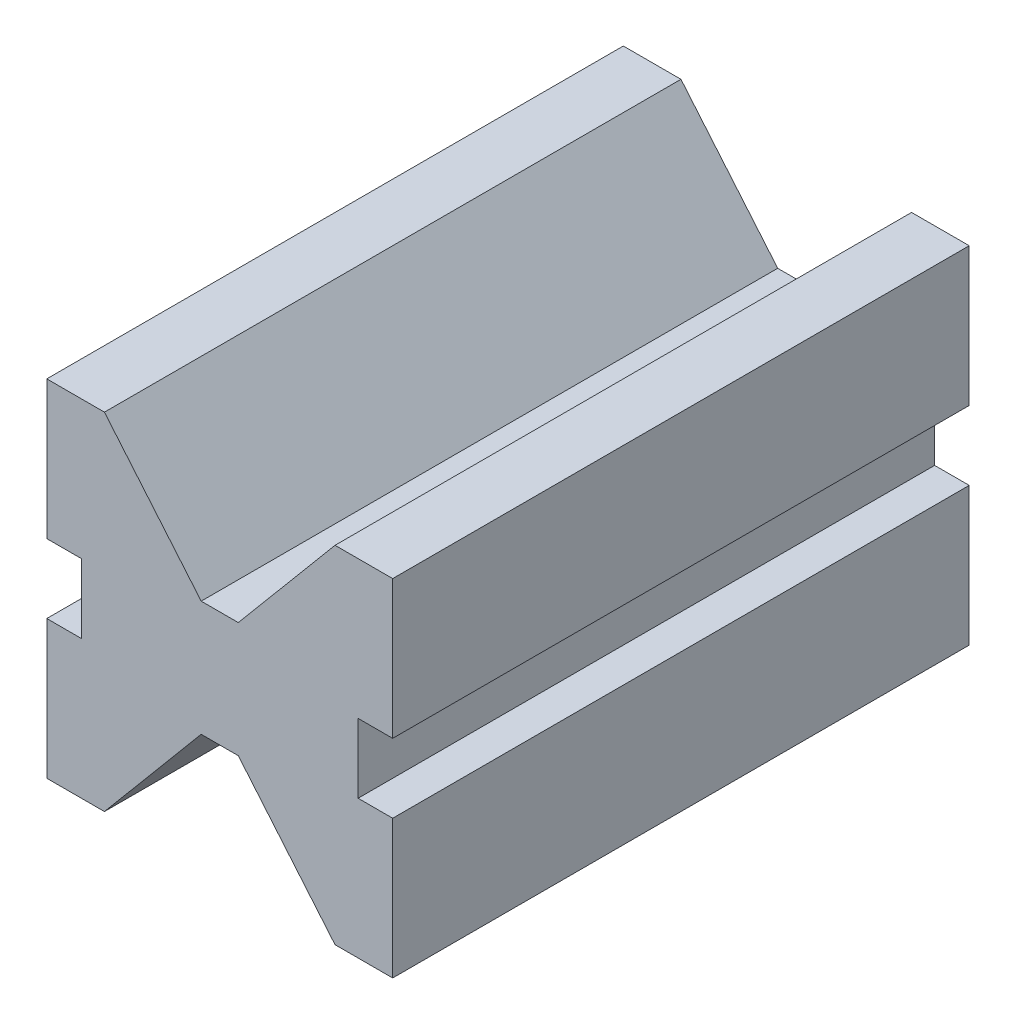
ISO-10303-21;
HEADER;
FILE_DESCRIPTION(('STEP AP214'),'2;1');
FILE_NAME('part.step','',(''),(''),'','','');
FILE_SCHEMA(('AUTOMOTIVE_DESIGN { 1 0 10303 214 1 1 1 1 }'));
ENDSEC;
DATA;
#1=APPLICATION_CONTEXT('core data for automotive mechanical design processes');
#2=APPLICATION_PROTOCOL_DEFINITION('international standard','automotive_design',2000,#1);
#3=PRODUCT_CONTEXT('',#1,'mechanical');
#4=PRODUCT('Part','Part','',(#3));
#5=PRODUCT_RELATED_PRODUCT_CATEGORY('part','',(#4));
#6=PRODUCT_DEFINITION_FORMATION('','',#4);
#7=PRODUCT_DEFINITION_CONTEXT('part definition',#1,'design');
#8=PRODUCT_DEFINITION('design','',#6,#7);
#9=PRODUCT_DEFINITION_SHAPE('','',#8);
#10=(LENGTH_UNIT() NAMED_UNIT(*) SI_UNIT(.MILLI.,.METRE.));
#11=(NAMED_UNIT(*) PLANE_ANGLE_UNIT() SI_UNIT($,.RADIAN.));
#12=(NAMED_UNIT(*) SI_UNIT($,.STERADIAN.) SOLID_ANGLE_UNIT());
#13=UNCERTAINTY_MEASURE_WITH_UNIT(LENGTH_MEASURE(1.E-05),#10,'distance_accuracy_value','');
#14=(GEOMETRIC_REPRESENTATION_CONTEXT(3) GLOBAL_UNCERTAINTY_ASSIGNED_CONTEXT((#13)) GLOBAL_UNIT_ASSIGNED_CONTEXT((#10,
#11,#12)) REPRESENTATION_CONTEXT('',''));
#15=CARTESIAN_POINT('',(0.,0.,0.));
#16=DIRECTION('',(0.,0.,1.));
#17=DIRECTION('',(1.,0.,0.));
#18=AXIS2_PLACEMENT_3D('',#15,#16,#17);
#19=CARTESIAN_POINT('',(20.,-30.,100.));
#20=DIRECTION('',(0.,1.,0.));
#21=DIRECTION('',(0.,0.,1.));
#22=AXIS2_PLACEMENT_3D('',#19,#20,#21);
#23=PLANE('',#22);
#24=DIRECTION('',(1.,0.,0.));
#25=VECTOR('',#24,1.);
#26=CARTESIAN_POINT('',(20.,-30.,0.));
#27=LINE('',#26,#25);
#28=CARTESIAN_POINT('',(20.,-30.,0.));
#29=VERTEX_POINT('',#28);
#30=CARTESIAN_POINT('',(30.,-30.,0.));
#31=VERTEX_POINT('',#30);
#32=EDGE_CURVE('E225',#29,#31,#27,.T.);
#33=ORIENTED_EDGE('',*,*,#32,.T.);
#34=DIRECTION('',(0.,0.,-1.));
#35=VECTOR('',#34,1.);
#36=CARTESIAN_POINT('',(30.,-30.,100.));
#37=LINE('',#36,#35);
#38=CARTESIAN_POINT('',(30.,-30.,100.));
#39=VERTEX_POINT('',#38);
#40=EDGE_CURVE('E11',#39,#31,#37,.T.);
#41=ORIENTED_EDGE('',*,*,#40,.F.);
#42=DIRECTION('',(1.,0.,0.));
#43=VECTOR('',#42,1.);
#44=CARTESIAN_POINT('',(20.,-30.,100.));
#45=LINE('',#44,#43);
#46=CARTESIAN_POINT('',(20.,-30.,100.));
#47=VERTEX_POINT('',#46);
#48=EDGE_CURVE('E279',#47,#39,#45,.T.);
#49=ORIENTED_EDGE('',*,*,#48,.F.);
#50=DIRECTION('',(0.,0.,-1.));
#51=VECTOR('',#50,1.);
#52=CARTESIAN_POINT('',(20.,-30.,100.));
#53=LINE('',#52,#51);
#54=EDGE_CURVE('E216',#47,#29,#53,.T.);
#55=ORIENTED_EDGE('',*,*,#54,.T.);
#56=EDGE_LOOP('',(#33,#41,#49,#55));
#57=FACE_BOUND('',#56,.T.);
#58=ADVANCED_FACE('F47',(#57),#23,.F.);
#59=CARTESIAN_POINT('',(30.,-6.00000000000002,100.));
#60=DIRECTION('',(-1.,0.,0.));
#61=DIRECTION('',(0.,-1.,0.));
#62=AXIS2_PLACEMENT_3D('',#59,#60,#61);
#63=PLANE('',#62);
#64=DIRECTION('',(0.,1.,0.));
#65=VECTOR('',#64,1.);
#66=CARTESIAN_POINT('',(30.,-6.00000000000002,0.));
#67=LINE('',#66,#65);
#68=CARTESIAN_POINT('',(30.,-6.00000000000002,0.));
#69=VERTEX_POINT('',#68);
#70=EDGE_CURVE('E226',#31,#69,#67,.T.);
#71=ORIENTED_EDGE('',*,*,#70,.T.);
#72=DIRECTION('',(0.,0.,-1.));
#73=VECTOR('',#72,1.);
#74=CARTESIAN_POINT('',(30.,-6.00000000000002,100.));
#75=LINE('',#74,#73);
#76=CARTESIAN_POINT('',(30.,-6.00000000000002,100.));
#77=VERTEX_POINT('',#76);
#78=EDGE_CURVE('E59',#77,#69,#75,.T.);
#79=ORIENTED_EDGE('',*,*,#78,.F.);
#80=DIRECTION('',(0.,1.,0.));
#81=VECTOR('',#80,1.);
#82=CARTESIAN_POINT('',(30.,-6.00000000000002,100.));
#83=LINE('',#82,#81);
#84=EDGE_CURVE('E144',#39,#77,#83,.T.);
#85=ORIENTED_EDGE('',*,*,#84,.F.);
#86=ORIENTED_EDGE('',*,*,#40,.T.);
#87=EDGE_LOOP('',(#71,#79,#85,#86));
#88=FACE_BOUND('',#87,.T.);
#89=ADVANCED_FACE('F428',(#88),#63,.F.);
#90=CARTESIAN_POINT('',(24.,-6.00000000000002,100.));
#91=DIRECTION('',(0.,-1.,0.));
#92=DIRECTION('',(1.,0.,0.));
#93=AXIS2_PLACEMENT_3D('',#90,#91,#92);
#94=PLANE('',#93);
#95=DIRECTION('',(-1.,0.,0.));
#96=VECTOR('',#95,1.);
#97=CARTESIAN_POINT('',(24.,-6.00000000000002,0.));
#98=LINE('',#97,#96);
#99=CARTESIAN_POINT('',(24.,-6.00000000000002,0.));
#100=VERTEX_POINT('',#99);
#101=EDGE_CURVE('E227',#69,#100,#98,.T.);
#102=ORIENTED_EDGE('',*,*,#101,.T.);
#103=DIRECTION('',(0.,0.,-1.));
#104=VECTOR('',#103,1.);
#105=CARTESIAN_POINT('',(24.,-6.00000000000002,100.));
#106=LINE('',#105,#104);
#107=CARTESIAN_POINT('',(24.,-6.00000000000002,100.));
#108=VERTEX_POINT('',#107);
#109=EDGE_CURVE('E339',#108,#100,#106,.T.);
#110=ORIENTED_EDGE('',*,*,#109,.F.);
#111=DIRECTION('',(-1.,0.,0.));
#112=VECTOR('',#111,1.);
#113=CARTESIAN_POINT('',(24.,-6.00000000000002,100.));
#114=LINE('',#113,#112);
#115=EDGE_CURVE('E350',#77,#108,#114,.T.);
#116=ORIENTED_EDGE('',*,*,#115,.F.);
#117=ORIENTED_EDGE('',*,*,#78,.T.);
#118=EDGE_LOOP('',(#102,#110,#116,#117));
#119=FACE_BOUND('',#118,.T.);
#120=ADVANCED_FACE('F347',(#119),#94,.F.);
#121=CARTESIAN_POINT('',(24.,5.99999999999999,100.));
#122=DIRECTION('',(-1.,0.,0.));
#123=DIRECTION('',(0.,-1.,0.));
#124=AXIS2_PLACEMENT_3D('',#121,#122,#123);
#125=PLANE('',#124);
#126=DIRECTION('',(0.,1.,0.));
#127=VECTOR('',#126,1.);
#128=CARTESIAN_POINT('',(24.,5.99999999999999,0.));
#129=LINE('',#128,#127);
#130=CARTESIAN_POINT('',(24.,5.99999999999999,0.));
#131=VERTEX_POINT('',#130);
#132=EDGE_CURVE('E235',#100,#131,#129,.T.);
#133=ORIENTED_EDGE('',*,*,#132,.T.);
#134=DIRECTION('',(0.,0.,-1.));
#135=VECTOR('',#134,1.);
#136=CARTESIAN_POINT('',(24.,5.99999999999999,100.));
#137=LINE('',#136,#135);
#138=CARTESIAN_POINT('',(24.,5.99999999999999,100.));
#139=VERTEX_POINT('',#138);
#140=EDGE_CURVE('E332',#139,#131,#137,.T.);
#141=ORIENTED_EDGE('',*,*,#140,.F.);
#142=DIRECTION('',(0.,1.,0.));
#143=VECTOR('',#142,1.);
#144=CARTESIAN_POINT('',(24.,5.99999999999999,100.));
#145=LINE('',#144,#143);
#146=EDGE_CURVE('E367',#108,#139,#145,.T.);
#147=ORIENTED_EDGE('',*,*,#146,.F.);
#148=ORIENTED_EDGE('',*,*,#109,.T.);
#149=EDGE_LOOP('',(#133,#141,#147,#148));
#150=FACE_BOUND('',#149,.T.);
#151=ADVANCED_FACE('F358',(#150),#125,.F.);
#152=CARTESIAN_POINT('',(30.,5.99999999999998,100.));
#153=DIRECTION('',(0.,1.,0.));
#154=DIRECTION('',(-1.,0.,0.));
#155=AXIS2_PLACEMENT_3D('',#152,#153,#154);
#156=PLANE('',#155);
#157=DIRECTION('',(1.,0.,0.));
#158=VECTOR('',#157,1.);
#159=CARTESIAN_POINT('',(30.,5.99999999999998,0.));
#160=LINE('',#159,#158);
#161=CARTESIAN_POINT('',(30.,5.99999999999998,0.));
#162=VERTEX_POINT('',#161);
#163=EDGE_CURVE('E234',#131,#162,#160,.T.);
#164=ORIENTED_EDGE('',*,*,#163,.T.);
#165=DIRECTION('',(0.,0.,-1.));
#166=VECTOR('',#165,1.);
#167=CARTESIAN_POINT('',(30.,5.99999999999998,100.));
#168=LINE('',#167,#166);
#169=CARTESIAN_POINT('',(30.,5.99999999999998,100.));
#170=VERTEX_POINT('',#169);
#171=EDGE_CURVE('E333',#170,#162,#168,.T.);
#172=ORIENTED_EDGE('',*,*,#171,.F.);
#173=DIRECTION('',(1.,0.,0.));
#174=VECTOR('',#173,1.);
#175=CARTESIAN_POINT('',(30.,5.99999999999998,100.));
#176=LINE('',#175,#174);
#177=EDGE_CURVE('E362',#139,#170,#176,.T.);
#178=ORIENTED_EDGE('',*,*,#177,.F.);
#179=ORIENTED_EDGE('',*,*,#140,.T.);
#180=EDGE_LOOP('',(#164,#172,#178,#179));
#181=FACE_BOUND('',#180,.T.);
#182=ADVANCED_FACE('F365',(#181),#156,.F.);
#183=CARTESIAN_POINT('',(30.,30.,100.));
#184=DIRECTION('',(-1.,0.,0.));
#185=DIRECTION('',(0.,-1.,0.));
#186=AXIS2_PLACEMENT_3D('',#183,#184,#185);
#187=PLANE('',#186);
#188=DIRECTION('',(0.,1.,0.));
#189=VECTOR('',#188,1.);
#190=CARTESIAN_POINT('',(30.,30.,0.));
#191=LINE('',#190,#189);
#192=CARTESIAN_POINT('',(30.,30.,0.));
#193=VERTEX_POINT('',#192);
#194=EDGE_CURVE('E239',#162,#193,#191,.T.);
#195=ORIENTED_EDGE('',*,*,#194,.T.);
#196=DIRECTION('',(0.,0.,-1.));
#197=VECTOR('',#196,1.);
#198=CARTESIAN_POINT('',(30.,30.,100.));
#199=LINE('',#198,#197);
#200=CARTESIAN_POINT('',(30.,30.,100.));
#201=VERTEX_POINT('',#200);
#202=EDGE_CURVE('E330',#201,#193,#199,.T.);
#203=ORIENTED_EDGE('',*,*,#202,.F.);
#204=DIRECTION('',(0.,1.,0.));
#205=VECTOR('',#204,1.);
#206=CARTESIAN_POINT('',(30.,30.,100.));
#207=LINE('',#206,#205);
#208=EDGE_CURVE('E370',#170,#201,#207,.T.);
#209=ORIENTED_EDGE('',*,*,#208,.F.);
#210=ORIENTED_EDGE('',*,*,#171,.T.);
#211=EDGE_LOOP('',(#195,#203,#209,#210));
#212=FACE_BOUND('',#211,.T.);
#213=ADVANCED_FACE('F441',(#212),#187,.F.);
#214=CARTESIAN_POINT('',(20.,30.,100.));
#215=DIRECTION('',(0.,-1.,0.));
#216=DIRECTION('',(0.,0.,-1.));
#217=AXIS2_PLACEMENT_3D('',#214,#215,#216);
#218=PLANE('',#217);
#219=DIRECTION('',(-1.,0.,0.));
#220=VECTOR('',#219,1.);
#221=CARTESIAN_POINT('',(20.,30.,0.));
#222=LINE('',#221,#220);
#223=CARTESIAN_POINT('',(20.,30.,0.));
#224=VERTEX_POINT('',#223);
#225=EDGE_CURVE('E243',#193,#224,#222,.T.);
#226=ORIENTED_EDGE('',*,*,#225,.T.);
#227=DIRECTION('',(0.,0.,-1.));
#228=VECTOR('',#227,1.);
#229=CARTESIAN_POINT('',(20.,30.,100.));
#230=LINE('',#229,#228);
#231=CARTESIAN_POINT('',(20.,30.,100.));
#232=VERTEX_POINT('',#231);
#233=EDGE_CURVE('E322',#232,#224,#230,.T.);
#234=ORIENTED_EDGE('',*,*,#233,.F.);
#235=DIRECTION('',(-1.,0.,0.));
#236=VECTOR('',#235,1.);
#237=CARTESIAN_POINT('',(20.,30.,100.));
#238=LINE('',#237,#236);
#239=EDGE_CURVE('E375',#201,#232,#238,.T.);
#240=ORIENTED_EDGE('',*,*,#239,.F.);
#241=ORIENTED_EDGE('',*,*,#202,.T.);
#242=EDGE_LOOP('',(#226,#234,#240,#241));
#243=FACE_BOUND('',#242,.T.);
#244=ADVANCED_FACE('F446',(#243),#218,.F.);
#245=CARTESIAN_POINT('',(3.21800737645445,10.,100.));
#246=DIRECTION('',(0.766044443118979,-0.642787609686538,0.));
#247=DIRECTION('',(0.642787609686538,0.766044443118979,0.));
#248=AXIS2_PLACEMENT_3D('',#245,#246,#247);
#249=PLANE('',#248);
#250=DIRECTION('',(-0.642787609686538,-0.766044443118979,0.));
#251=VECTOR('',#250,1.);
#252=CARTESIAN_POINT('',(3.21800737645445,10.,0.));
#253=LINE('',#252,#251);
#254=CARTESIAN_POINT('',(3.21800737645445,10.,0.));
#255=VERTEX_POINT('',#254);
#256=EDGE_CURVE('E244',#224,#255,#253,.T.);
#257=ORIENTED_EDGE('',*,*,#256,.T.);
#258=DIRECTION('',(0.,0.,-1.));
#259=VECTOR('',#258,1.);
#260=CARTESIAN_POINT('',(3.21800737645445,10.,100.));
#261=LINE('',#260,#259);
#262=CARTESIAN_POINT('',(3.21800737645445,10.,100.));
#263=VERTEX_POINT('',#262);
#264=EDGE_CURVE('E317',#263,#255,#261,.T.);
#265=ORIENTED_EDGE('',*,*,#264,.F.);
#266=DIRECTION('',(-0.642787609686538,-0.766044443118979,0.));
#267=VECTOR('',#266,1.);
#268=CARTESIAN_POINT('',(3.21800737645445,10.,100.));
#269=LINE('',#268,#267);
#270=EDGE_CURVE('E379',#232,#263,#269,.T.);
#271=ORIENTED_EDGE('',*,*,#270,.F.);
#272=ORIENTED_EDGE('',*,*,#233,.T.);
#273=EDGE_LOOP('',(#257,#265,#271,#272));
#274=FACE_BOUND('',#273,.T.);
#275=ADVANCED_FACE('F449',(#274),#249,.F.);
#276=CARTESIAN_POINT('',(-3.21800737645445,10.,100.));
#277=DIRECTION('',(0.,-1.,0.));
#278=DIRECTION('',(0.,0.,-1.));
#279=AXIS2_PLACEMENT_3D('',#276,#277,#278);
#280=PLANE('',#279);
#281=DIRECTION('',(-1.,0.,0.));
#282=VECTOR('',#281,1.);
#283=CARTESIAN_POINT('',(-3.21800737645445,10.,0.));
#284=LINE('',#283,#282);
#285=CARTESIAN_POINT('',(-3.21800737645445,10.,0.));
#286=VERTEX_POINT('',#285);
#287=EDGE_CURVE('E250',#255,#286,#284,.T.);
#288=ORIENTED_EDGE('',*,*,#287,.T.);
#289=DIRECTION('',(0.,0.,-1.));
#290=VECTOR('',#289,1.);
#291=CARTESIAN_POINT('',(-3.21800737645445,10.,100.));
#292=LINE('',#291,#290);
#293=CARTESIAN_POINT('',(-3.21800737645445,10.,100.));
#294=VERTEX_POINT('',#293);
#295=EDGE_CURVE('E314',#294,#286,#292,.T.);
#296=ORIENTED_EDGE('',*,*,#295,.F.);
#297=DIRECTION('',(-1.,0.,0.));
#298=VECTOR('',#297,1.);
#299=CARTESIAN_POINT('',(-3.21800737645445,10.,100.));
#300=LINE('',#299,#298);
#301=EDGE_CURVE('E385',#263,#294,#300,.T.);
#302=ORIENTED_EDGE('',*,*,#301,.F.);
#303=ORIENTED_EDGE('',*,*,#264,.T.);
#304=EDGE_LOOP('',(#288,#296,#302,#303));
#305=FACE_BOUND('',#304,.T.);
#306=ADVANCED_FACE('F452',(#305),#280,.F.);
#307=CARTESIAN_POINT('',(-20.,30.,100.));
#308=DIRECTION('',(-0.766044443118979,-0.642787609686538,0.));
#309=DIRECTION('',(0.642787609686538,-0.766044443118979,0.));
#310=AXIS2_PLACEMENT_3D('',#307,#308,#309);
#311=PLANE('',#310);
#312=DIRECTION('',(-0.642787609686538,0.766044443118979,0.));
#313=VECTOR('',#312,1.);
#314=CARTESIAN_POINT('',(-20.,30.,0.));
#315=LINE('',#314,#313);
#316=CARTESIAN_POINT('',(-20.,30.,0.));
#317=VERTEX_POINT('',#316);
#318=EDGE_CURVE('E248',#286,#317,#315,.T.);
#319=ORIENTED_EDGE('',*,*,#318,.T.);
#320=DIRECTION('',(0.,0.,-1.));
#321=VECTOR('',#320,1.);
#322=CARTESIAN_POINT('',(-20.,30.,100.));
#323=LINE('',#322,#321);
#324=CARTESIAN_POINT('',(-20.,30.,100.));
#325=VERTEX_POINT('',#324);
#326=EDGE_CURVE('E311',#325,#317,#323,.T.);
#327=ORIENTED_EDGE('',*,*,#326,.F.);
#328=DIRECTION('',(-0.642787609686538,0.766044443118979,0.));
#329=VECTOR('',#328,1.);
#330=CARTESIAN_POINT('',(-20.,30.,100.));
#331=LINE('',#330,#329);
#332=EDGE_CURVE('E383',#294,#325,#331,.T.);
#333=ORIENTED_EDGE('',*,*,#332,.F.);
#334=ORIENTED_EDGE('',*,*,#295,.T.);
#335=EDGE_LOOP('',(#319,#327,#333,#334));
#336=FACE_BOUND('',#335,.T.);
#337=ADVANCED_FACE('F457',(#336),#311,.F.);
#338=CARTESIAN_POINT('',(-30.,30.,100.));
#339=DIRECTION('',(0.,-1.,0.));
#340=DIRECTION('',(1.,0.,0.));
#341=AXIS2_PLACEMENT_3D('',#338,#339,#340);
#342=PLANE('',#341);
#343=DIRECTION('',(-1.,0.,0.));
#344=VECTOR('',#343,1.);
#345=CARTESIAN_POINT('',(-30.,30.,0.));
#346=LINE('',#345,#344);
#347=CARTESIAN_POINT('',(-30.,30.,0.));
#348=VERTEX_POINT('',#347);
#349=EDGE_CURVE('E254',#317,#348,#346,.T.);
#350=ORIENTED_EDGE('',*,*,#349,.T.);
#351=DIRECTION('',(0.,0.,-1.));
#352=VECTOR('',#351,1.);
#353=CARTESIAN_POINT('',(-30.,30.,100.));
#354=LINE('',#353,#352);
#355=CARTESIAN_POINT('',(-30.,30.,100.));
#356=VERTEX_POINT('',#355);
#357=EDGE_CURVE('E310',#356,#348,#354,.T.);
#358=ORIENTED_EDGE('',*,*,#357,.F.);
#359=DIRECTION('',(-1.,0.,0.));
#360=VECTOR('',#359,1.);
#361=CARTESIAN_POINT('',(-30.,30.,100.));
#362=LINE('',#361,#360);
#363=EDGE_CURVE('E389',#325,#356,#362,.T.);
#364=ORIENTED_EDGE('',*,*,#363,.F.);
#365=ORIENTED_EDGE('',*,*,#326,.T.);
#366=EDGE_LOOP('',(#350,#358,#364,#365));
#367=FACE_BOUND('',#366,.T.);
#368=ADVANCED_FACE('F465',(#367),#342,.F.);
#369=CARTESIAN_POINT('',(-30.,30.,100.));
#370=DIRECTION('',(1.,0.,0.));
#371=DIRECTION('',(0.,1.,0.));
#372=AXIS2_PLACEMENT_3D('',#369,#370,#371);
#373=PLANE('',#372);
#374=DIRECTION('',(0.,-1.,0.));
#375=VECTOR('',#374,1.);
#376=CARTESIAN_POINT('',(-30.,30.,0.));
#377=LINE('',#376,#375);
#378=CARTESIAN_POINT('',(-30.,6.,0.));
#379=VERTEX_POINT('',#378);
#380=EDGE_CURVE('E258',#348,#379,#377,.T.);
#381=ORIENTED_EDGE('',*,*,#380,.T.);
#382=DIRECTION('',(0.,0.,-1.));
#383=VECTOR('',#382,1.);
#384=CARTESIAN_POINT('',(-30.,6.,100.));
#385=LINE('',#384,#383);
#386=CARTESIAN_POINT('',(-30.,6.,100.));
#387=VERTEX_POINT('',#386);
#388=EDGE_CURVE('E301',#387,#379,#385,.T.);
#389=ORIENTED_EDGE('',*,*,#388,.F.);
#390=DIRECTION('',(0.,-1.,0.));
#391=VECTOR('',#390,1.);
#392=CARTESIAN_POINT('',(-30.,30.,100.));
#393=LINE('',#392,#391);
#394=EDGE_CURVE('E393',#356,#387,#393,.T.);
#395=ORIENTED_EDGE('',*,*,#394,.F.);
#396=ORIENTED_EDGE('',*,*,#357,.T.);
#397=EDGE_LOOP('',(#381,#389,#395,#396));
#398=FACE_BOUND('',#397,.T.);
#399=ADVANCED_FACE('F468',(#398),#373,.F.);
#400=CARTESIAN_POINT('',(-30.,6.,100.));
#401=DIRECTION('',(0.,1.,0.));
#402=DIRECTION('',(-1.,0.,0.));
#403=AXIS2_PLACEMENT_3D('',#400,#401,#402);
#404=PLANE('',#403);
#405=DIRECTION('',(1.,0.,0.));
#406=VECTOR('',#405,1.);
#407=CARTESIAN_POINT('',(-30.,6.,0.));
#408=LINE('',#407,#406);
#409=CARTESIAN_POINT('',(-24.,5.99999999999999,0.));
#410=VERTEX_POINT('',#409);
#411=EDGE_CURVE('E260',#379,#410,#408,.T.);
#412=ORIENTED_EDGE('',*,*,#411,.T.);
#413=DIRECTION('',(0.,0.,-1.));
#414=VECTOR('',#413,1.);
#415=CARTESIAN_POINT('',(-24.,5.99999999999999,100.));
#416=LINE('',#415,#414);
#417=CARTESIAN_POINT('',(-24.,5.99999999999999,100.));
#418=VERTEX_POINT('',#417);
#419=EDGE_CURVE('E298',#418,#410,#416,.T.);
#420=ORIENTED_EDGE('',*,*,#419,.F.);
#421=DIRECTION('',(1.,0.,0.));
#422=VECTOR('',#421,1.);
#423=CARTESIAN_POINT('',(-30.,6.,100.));
#424=LINE('',#423,#422);
#425=EDGE_CURVE('E395',#387,#418,#424,.T.);
#426=ORIENTED_EDGE('',*,*,#425,.F.);
#427=ORIENTED_EDGE('',*,*,#388,.T.);
#428=EDGE_LOOP('',(#412,#420,#426,#427));
#429=FACE_BOUND('',#428,.T.);
#430=ADVANCED_FACE('F467',(#429),#404,.F.);
#431=CARTESIAN_POINT('',(-24.,5.99999999999999,100.));
#432=DIRECTION('',(1.,0.,0.));
#433=DIRECTION('',(0.,0.,-1.));
#434=AXIS2_PLACEMENT_3D('',#431,#432,#433);
#435=PLANE('',#434);
#436=DIRECTION('',(0.,-1.,0.));
#437=VECTOR('',#436,1.);
#438=CARTESIAN_POINT('',(-24.,5.99999999999999,0.));
#439=LINE('',#438,#437);
#440=CARTESIAN_POINT('',(-24.,-6.00000000000001,0.));
#441=VERTEX_POINT('',#440);
#442=EDGE_CURVE('E265',#410,#441,#439,.T.);
#443=ORIENTED_EDGE('',*,*,#442,.T.);
#444=DIRECTION('',(0.,0.,-1.));
#445=VECTOR('',#444,1.);
#446=CARTESIAN_POINT('',(-24.,-6.00000000000001,100.));
#447=LINE('',#446,#445);
#448=CARTESIAN_POINT('',(-24.,-6.00000000000001,100.));
#449=VERTEX_POINT('',#448);
#450=EDGE_CURVE('E293',#449,#441,#447,.T.);
#451=ORIENTED_EDGE('',*,*,#450,.F.);
#452=DIRECTION('',(0.,-1.,0.));
#453=VECTOR('',#452,1.);
#454=CARTESIAN_POINT('',(-24.,5.99999999999999,100.));
#455=LINE('',#454,#453);
#456=EDGE_CURVE('E400',#418,#449,#455,.T.);
#457=ORIENTED_EDGE('',*,*,#456,.F.);
#458=ORIENTED_EDGE('',*,*,#419,.T.);
#459=EDGE_LOOP('',(#443,#451,#457,#458));
#460=FACE_BOUND('',#459,.T.);
#461=ADVANCED_FACE('F474',(#460),#435,.F.);
#462=CARTESIAN_POINT('',(-24.,-6.00000000000001,100.));
#463=DIRECTION('',(0.,-1.,0.));
#464=DIRECTION('',(1.,0.,0.));
#465=AXIS2_PLACEMENT_3D('',#462,#463,#464);
#466=PLANE('',#465);
#467=DIRECTION('',(-1.,0.,0.));
#468=VECTOR('',#467,1.);
#469=CARTESIAN_POINT('',(-24.,-6.00000000000001,0.));
#470=LINE('',#469,#468);
#471=CARTESIAN_POINT('',(-30.,-6.,0.));
#472=VERTEX_POINT('',#471);
#473=EDGE_CURVE('E262',#441,#472,#470,.T.);
#474=ORIENTED_EDGE('',*,*,#473,.T.);
#475=DIRECTION('',(0.,0.,-1.));
#476=VECTOR('',#475,1.);
#477=CARTESIAN_POINT('',(-30.,-6.,100.));
#478=LINE('',#477,#476);
#479=CARTESIAN_POINT('',(-30.,-6.,100.));
#480=VERTEX_POINT('',#479);
#481=EDGE_CURVE('E292',#480,#472,#478,.T.);
#482=ORIENTED_EDGE('',*,*,#481,.F.);
#483=DIRECTION('',(-1.,0.,0.));
#484=VECTOR('',#483,1.);
#485=CARTESIAN_POINT('',(-24.,-6.00000000000001,100.));
#486=LINE('',#485,#484);
#487=EDGE_CURVE('E397',#449,#480,#486,.T.);
#488=ORIENTED_EDGE('',*,*,#487,.F.);
#489=ORIENTED_EDGE('',*,*,#450,.T.);
#490=EDGE_LOOP('',(#474,#482,#488,#489));
#491=FACE_BOUND('',#490,.T.);
#492=ADVANCED_FACE('F479',(#491),#466,.F.);
#493=CARTESIAN_POINT('',(-30.,-6.,100.));
#494=DIRECTION('',(1.,0.,0.));
#495=DIRECTION('',(0.,1.,0.));
#496=AXIS2_PLACEMENT_3D('',#493,#494,#495);
#497=PLANE('',#496);
#498=DIRECTION('',(0.,-1.,0.));
#499=VECTOR('',#498,1.);
#500=CARTESIAN_POINT('',(-30.,-6.,0.));
#501=LINE('',#500,#499);
#502=CARTESIAN_POINT('',(-30.,-30.,0.));
#503=VERTEX_POINT('',#502);
#504=EDGE_CURVE('E268',#472,#503,#501,.T.);
#505=ORIENTED_EDGE('',*,*,#504,.T.);
#506=DIRECTION('',(0.,0.,-1.));
#507=VECTOR('',#506,1.);
#508=CARTESIAN_POINT('',(-30.,-30.,100.));
#509=LINE('',#508,#507);
#510=CARTESIAN_POINT('',(-30.,-30.,100.));
#511=VERTEX_POINT('',#510);
#512=EDGE_CURVE('E290',#511,#503,#509,.T.);
#513=ORIENTED_EDGE('',*,*,#512,.F.);
#514=DIRECTION('',(0.,-1.,0.));
#515=VECTOR('',#514,1.);
#516=CARTESIAN_POINT('',(-30.,-6.,100.));
#517=LINE('',#516,#515);
#518=EDGE_CURVE('E403',#480,#511,#517,.T.);
#519=ORIENTED_EDGE('',*,*,#518,.F.);
#520=ORIENTED_EDGE('',*,*,#481,.T.);
#521=EDGE_LOOP('',(#505,#513,#519,#520));
#522=FACE_BOUND('',#521,.T.);
#523=ADVANCED_FACE('F411',(#522),#497,.F.);
#524=CARTESIAN_POINT('',(-30.,-30.,100.));
#525=DIRECTION('',(0.,1.,0.));
#526=DIRECTION('',(-1.,0.,0.));
#527=AXIS2_PLACEMENT_3D('',#524,#525,#526);
#528=PLANE('',#527);
#529=DIRECTION('',(1.,0.,0.));
#530=VECTOR('',#529,1.);
#531=CARTESIAN_POINT('',(-30.,-30.,0.));
#532=LINE('',#531,#530);
#533=CARTESIAN_POINT('',(-20.,-30.,0.));
#534=VERTEX_POINT('',#533);
#535=EDGE_CURVE('E271',#503,#534,#532,.T.);
#536=ORIENTED_EDGE('',*,*,#535,.T.);
#537=DIRECTION('',(0.,0.,-1.));
#538=VECTOR('',#537,1.);
#539=CARTESIAN_POINT('',(-20.,-30.,100.));
#540=LINE('',#539,#538);
#541=CARTESIAN_POINT('',(-20.,-30.,100.));
#542=VERTEX_POINT('',#541);
#543=EDGE_CURVE('E213',#542,#534,#540,.T.);
#544=ORIENTED_EDGE('',*,*,#543,.F.);
#545=DIRECTION('',(1.,0.,0.));
#546=VECTOR('',#545,1.);
#547=CARTESIAN_POINT('',(-30.,-30.,100.));
#548=LINE('',#547,#546);
#549=EDGE_CURVE('E197',#511,#542,#548,.T.);
#550=ORIENTED_EDGE('',*,*,#549,.F.);
#551=ORIENTED_EDGE('',*,*,#512,.T.);
#552=EDGE_LOOP('',(#536,#544,#550,#551));
#553=FACE_BOUND('',#552,.T.);
#554=ADVANCED_FACE('F414',(#553),#528,.F.);
#555=CARTESIAN_POINT('',(-20.,-30.,100.));
#556=DIRECTION('',(-0.766044443118979,0.642787609686538,0.));
#557=DIRECTION('',(-0.642787609686538,-0.766044443118979,0.));
#558=AXIS2_PLACEMENT_3D('',#555,#556,#557);
#559=PLANE('',#558);
#560=DIRECTION('',(0.642787609686538,0.766044443118979,0.));
#561=VECTOR('',#560,1.);
#562=CARTESIAN_POINT('',(-20.,-30.,0.));
#563=LINE('',#562,#561);
#564=CARTESIAN_POINT('',(-3.21800737645445,-10.,0.));
#565=VERTEX_POINT('',#564);
#566=EDGE_CURVE('E208',#534,#565,#563,.T.);
#567=ORIENTED_EDGE('',*,*,#566,.T.);
#568=DIRECTION('',(0.,0.,-1.));
#569=VECTOR('',#568,1.);
#570=CARTESIAN_POINT('',(-3.21800737645445,-10.,100.));
#571=LINE('',#570,#569);
#572=CARTESIAN_POINT('',(-3.21800737645445,-10.,100.));
#573=VERTEX_POINT('',#572);
#574=EDGE_CURVE('E206',#573,#565,#571,.T.);
#575=ORIENTED_EDGE('',*,*,#574,.F.);
#576=DIRECTION('',(0.642787609686538,0.766044443118979,0.));
#577=VECTOR('',#576,1.);
#578=CARTESIAN_POINT('',(-20.,-30.,100.));
#579=LINE('',#578,#577);
#580=EDGE_CURVE('E191',#542,#573,#579,.T.);
#581=ORIENTED_EDGE('',*,*,#580,.F.);
#582=ORIENTED_EDGE('',*,*,#543,.T.);
#583=EDGE_LOOP('',(#567,#575,#581,#582));
#584=FACE_BOUND('',#583,.T.);
#585=ADVANCED_FACE('F207',(#584),#559,.F.);
#586=CARTESIAN_POINT('',(-3.21800737645445,-10.,100.));
#587=DIRECTION('',(0.,1.,0.));
#588=DIRECTION('',(0.,0.,1.));
#589=AXIS2_PLACEMENT_3D('',#586,#587,#588);
#590=PLANE('',#589);
#591=DIRECTION('',(1.,0.,0.));
#592=VECTOR('',#591,1.);
#593=CARTESIAN_POINT('',(-3.21800737645445,-10.,0.));
#594=LINE('',#593,#592);
#595=CARTESIAN_POINT('',(3.21800737645445,-10.,0.));
#596=VERTEX_POINT('',#595);
#597=EDGE_CURVE('E131',#565,#596,#594,.T.);
#598=ORIENTED_EDGE('',*,*,#597,.T.);
#599=DIRECTION('',(0.,0.,-1.));
#600=VECTOR('',#599,1.);
#601=CARTESIAN_POINT('',(3.21800737645445,-10.,100.));
#602=LINE('',#601,#600);
#603=CARTESIAN_POINT('',(3.21800737645445,-10.,100.));
#604=VERTEX_POINT('',#603);
#605=EDGE_CURVE('E212',#604,#596,#602,.T.);
#606=ORIENTED_EDGE('',*,*,#605,.F.);
#607=DIRECTION('',(1.,0.,0.));
#608=VECTOR('',#607,1.);
#609=CARTESIAN_POINT('',(-3.21800737645445,-10.,100.));
#610=LINE('',#609,#608);
#611=EDGE_CURVE('E196',#573,#604,#610,.T.);
#612=ORIENTED_EDGE('',*,*,#611,.F.);
#613=ORIENTED_EDGE('',*,*,#574,.T.);
#614=EDGE_LOOP('',(#598,#606,#612,#613));
#615=FACE_BOUND('',#614,.T.);
#616=ADVANCED_FACE('F215',(#615),#590,.F.);
#617=CARTESIAN_POINT('',(3.21800737645445,-10.,100.));
#618=DIRECTION('',(0.766044443118979,0.642787609686538,0.));
#619=DIRECTION('',(-0.642787609686538,0.766044443118979,0.));
#620=AXIS2_PLACEMENT_3D('',#617,#618,#619);
#621=PLANE('',#620);
#622=DIRECTION('',(0.642787609686538,-0.766044443118979,0.));
#623=VECTOR('',#622,1.);
#624=CARTESIAN_POINT('',(3.21800737645445,-10.,0.));
#625=LINE('',#624,#623);
#626=EDGE_CURVE('E140',#596,#29,#625,.T.);
#627=ORIENTED_EDGE('',*,*,#626,.T.);
#628=ORIENTED_EDGE('',*,*,#54,.F.);
#629=DIRECTION('',(0.642787609686538,-0.766044443118979,0.));
#630=VECTOR('',#629,1.);
#631=CARTESIAN_POINT('',(3.21800737645445,-10.,100.));
#632=LINE('',#631,#630);
#633=EDGE_CURVE('E67',#604,#47,#632,.T.);
#634=ORIENTED_EDGE('',*,*,#633,.F.);
#635=ORIENTED_EDGE('',*,*,#605,.T.);
#636=EDGE_LOOP('',(#627,#628,#634,#635));
#637=FACE_BOUND('',#636,.T.);
#638=ADVANCED_FACE('F416',(#637),#621,.F.);
#639=CARTESIAN_POINT('',(0.,0.,100.));
#640=DIRECTION('',(0.,0.,-1.));
#641=DIRECTION('',(-1.,0.,0.));
#642=AXIS2_PLACEMENT_3D('',#639,#640,#641);
#643=PLANE('',#642);
#644=ORIENTED_EDGE('',*,*,#48,.T.);
#645=ORIENTED_EDGE('',*,*,#84,.T.);
#646=ORIENTED_EDGE('',*,*,#115,.T.);
#647=ORIENTED_EDGE('',*,*,#146,.T.);
#648=ORIENTED_EDGE('',*,*,#177,.T.);
#649=ORIENTED_EDGE('',*,*,#208,.T.);
#650=ORIENTED_EDGE('',*,*,#239,.T.);
#651=ORIENTED_EDGE('',*,*,#270,.T.);
#652=ORIENTED_EDGE('',*,*,#301,.T.);
#653=ORIENTED_EDGE('',*,*,#332,.T.);
#654=ORIENTED_EDGE('',*,*,#363,.T.);
#655=ORIENTED_EDGE('',*,*,#394,.T.);
#656=ORIENTED_EDGE('',*,*,#425,.T.);
#657=ORIENTED_EDGE('',*,*,#456,.T.);
#658=ORIENTED_EDGE('',*,*,#487,.T.);
#659=ORIENTED_EDGE('',*,*,#518,.T.);
#660=ORIENTED_EDGE('',*,*,#549,.T.);
#661=ORIENTED_EDGE('',*,*,#580,.T.);
#662=ORIENTED_EDGE('',*,*,#611,.T.);
#663=ORIENTED_EDGE('',*,*,#633,.T.);
#664=EDGE_LOOP('',(#644,#645,#646,#647,#648,#649,#650,#651,#652,#653,#654,#655,#656,#657,#658,
#659,#660,#661,#662,#663));
#665=FACE_BOUND('',#664,.T.);
#666=ADVANCED_FACE('F198',(#665),#643,.F.);
#667=CARTESIAN_POINT('',(0.,0.,0.));
#668=DIRECTION('',(0.,0.,-1.));
#669=DIRECTION('',(-1.,0.,0.));
#670=AXIS2_PLACEMENT_3D('',#667,#668,#669);
#671=PLANE('',#670);
#672=ORIENTED_EDGE('',*,*,#32,.F.);
#673=ORIENTED_EDGE('',*,*,#626,.F.);
#674=ORIENTED_EDGE('',*,*,#597,.F.);
#675=ORIENTED_EDGE('',*,*,#566,.F.);
#676=ORIENTED_EDGE('',*,*,#535,.F.);
#677=ORIENTED_EDGE('',*,*,#504,.F.);
#678=ORIENTED_EDGE('',*,*,#473,.F.);
#679=ORIENTED_EDGE('',*,*,#442,.F.);
#680=ORIENTED_EDGE('',*,*,#411,.F.);
#681=ORIENTED_EDGE('',*,*,#380,.F.);
#682=ORIENTED_EDGE('',*,*,#349,.F.);
#683=ORIENTED_EDGE('',*,*,#318,.F.);
#684=ORIENTED_EDGE('',*,*,#287,.F.);
#685=ORIENTED_EDGE('',*,*,#256,.F.);
#686=ORIENTED_EDGE('',*,*,#225,.F.);
#687=ORIENTED_EDGE('',*,*,#194,.F.);
#688=ORIENTED_EDGE('',*,*,#163,.F.);
#689=ORIENTED_EDGE('',*,*,#132,.F.);
#690=ORIENTED_EDGE('',*,*,#101,.F.);
#691=ORIENTED_EDGE('',*,*,#70,.F.);
#692=EDGE_LOOP('',(#672,#673,#674,#675,#676,#677,#678,#679,#680,#681,#682,#683,#684,#685,#686,
#687,#688,#689,#690,#691));
#693=FACE_BOUND('',#692,.T.);
#694=ADVANCED_FACE('F351',(#693),#671,.T.);
#695=CLOSED_SHELL('',(#58,#89,#120,#151,#182,#213,#244,#275,#306,#337,#368,#399,#430,#461,#492,
#523,#554,#585,#616,#638,#666,#694));
#696=MANIFOLD_SOLID_BREP('B2',#695);
#697=ADVANCED_BREP_SHAPE_REPRESENTATION('',(#18,#696),#14);
#698=SHAPE_DEFINITION_REPRESENTATION(#9,#697);
ENDSEC;
END-ISO-10303-21;
